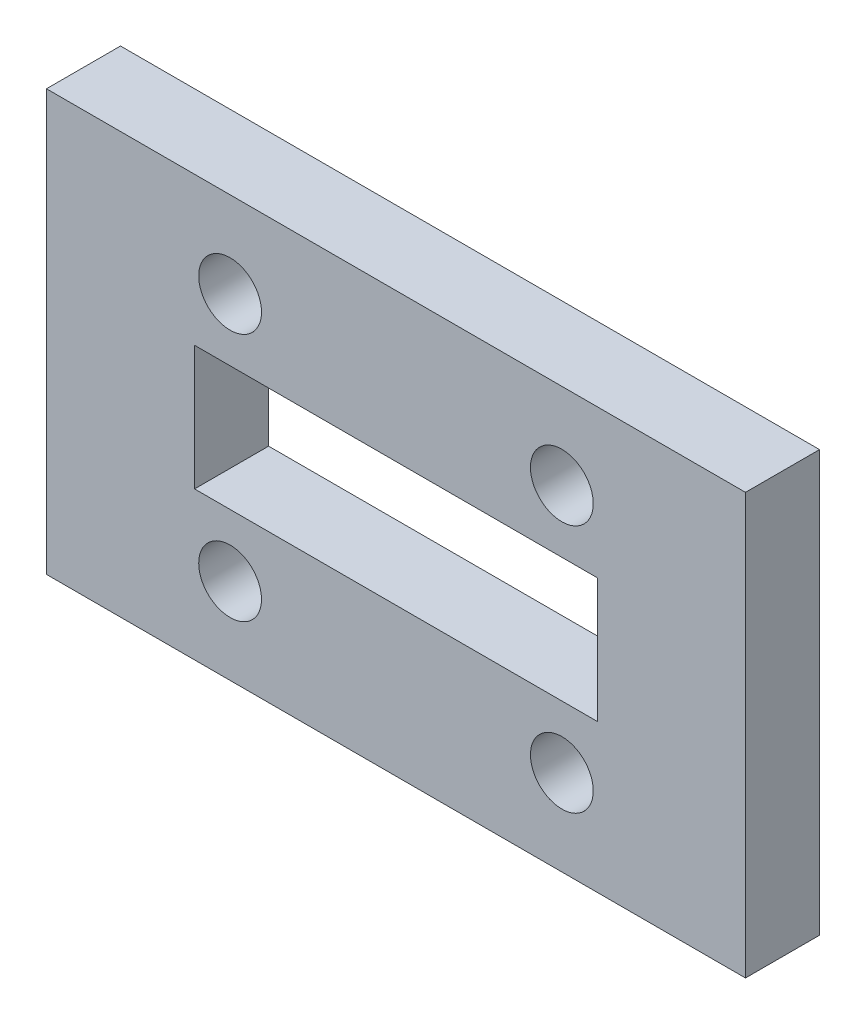
ISO-10303-21;
HEADER;
FILE_DESCRIPTION(('STEP AP214'),'2;1');
FILE_NAME('part.step','',(''),(''),'','','');
FILE_SCHEMA(('AUTOMOTIVE_DESIGN { 1 0 10303 214 1 1 1 1 }'));
ENDSEC;
DATA;
#1=APPLICATION_CONTEXT('core data for automotive mechanical design processes');
#2=APPLICATION_PROTOCOL_DEFINITION('international standard','automotive_design',2000,#1);
#3=PRODUCT_CONTEXT('',#1,'mechanical');
#4=PRODUCT('Part','Part','',(#3));
#5=PRODUCT_RELATED_PRODUCT_CATEGORY('part','',(#4));
#6=PRODUCT_DEFINITION_FORMATION('','',#4);
#7=PRODUCT_DEFINITION_CONTEXT('part definition',#1,'design');
#8=PRODUCT_DEFINITION('design','',#6,#7);
#9=PRODUCT_DEFINITION_SHAPE('','',#8);
#10=(LENGTH_UNIT() NAMED_UNIT(*) SI_UNIT(.MILLI.,.METRE.));
#11=(NAMED_UNIT(*) PLANE_ANGLE_UNIT() SI_UNIT($,.RADIAN.));
#12=(NAMED_UNIT(*) SI_UNIT($,.STERADIAN.) SOLID_ANGLE_UNIT());
#13=UNCERTAINTY_MEASURE_WITH_UNIT(LENGTH_MEASURE(1.E-05),#10,'distance_accuracy_value','');
#14=(GEOMETRIC_REPRESENTATION_CONTEXT(3) GLOBAL_UNCERTAINTY_ASSIGNED_CONTEXT((#13)) GLOBAL_UNIT_ASSIGNED_CONTEXT((#10,
#11,#12)) REPRESENTATION_CONTEXT('',''));
#15=CARTESIAN_POINT('',(0.,0.,0.));
#16=DIRECTION('',(0.,0.,1.));
#17=DIRECTION('',(1.,0.,0.));
#18=AXIS2_PLACEMENT_3D('',#15,#16,#17);
#19=CARTESIAN_POINT('',(0.,0.,3.175));
#20=DIRECTION('',(0.,0.,1.));
#21=DIRECTION('',(1.,0.,0.));
#22=AXIS2_PLACEMENT_3D('',#19,#20,#21);
#23=PLANE('',#22);
#24=CARTESIAN_POINT('',(7.112,-5.334,3.175));
#25=DIRECTION('',(0.,0.,1.));
#26=DIRECTION('',(1.,0.,0.));
#27=AXIS2_PLACEMENT_3D('',#24,#25,#26);
#28=CIRCLE('',#27,1.3462);
#29=CARTESIAN_POINT('',(8.4582,-5.334,3.175));
#30=VERTEX_POINT('',#29);
#31=EDGE_CURVE('E245',#30,#30,#28,.T.);
#32=ORIENTED_EDGE('',*,*,#31,.F.);
#33=EDGE_LOOP('',(#32));
#34=FACE_BOUND('',#33,.T.);
#35=CARTESIAN_POINT('',(-7.112,5.334,3.175));
#36=DIRECTION('',(0.,0.,1.));
#37=DIRECTION('',(1.,0.,0.));
#38=AXIS2_PLACEMENT_3D('',#35,#36,#37);
#39=CIRCLE('',#38,1.3462);
#40=CARTESIAN_POINT('',(-5.7658,5.334,3.175));
#41=VERTEX_POINT('',#40);
#42=EDGE_CURVE('E127',#41,#41,#39,.T.);
#43=ORIENTED_EDGE('',*,*,#42,.F.);
#44=EDGE_LOOP('',(#43));
#45=FACE_BOUND('',#44,.T.);
#46=DIRECTION('',(0.,-1.,0.));
#47=VECTOR('',#46,1.);
#48=CARTESIAN_POINT('',(-14.986,-9.017,3.175));
#49=LINE('',#48,#47);
#50=CARTESIAN_POINT('',(-14.986,9.017,3.175));
#51=VERTEX_POINT('',#50);
#52=CARTESIAN_POINT('',(-14.986,-9.017,3.175));
#53=VERTEX_POINT('',#52);
#54=EDGE_CURVE('E137',#51,#53,#49,.T.);
#55=ORIENTED_EDGE('',*,*,#54,.T.);
#56=DIRECTION('',(1.,0.,0.));
#57=VECTOR('',#56,1.);
#58=CARTESIAN_POINT('',(14.986,-9.017,3.175));
#59=LINE('',#58,#57);
#60=CARTESIAN_POINT('',(14.986,-9.017,3.175));
#61=VERTEX_POINT('',#60);
#62=EDGE_CURVE('E140',#53,#61,#59,.T.);
#63=ORIENTED_EDGE('',*,*,#62,.T.);
#64=DIRECTION('',(0.,1.,0.));
#65=VECTOR('',#64,1.);
#66=CARTESIAN_POINT('',(14.986,-9.017,3.175));
#67=LINE('',#66,#65);
#68=CARTESIAN_POINT('',(14.986,9.017,3.175));
#69=VERTEX_POINT('',#68);
#70=EDGE_CURVE('E143',#61,#69,#67,.T.);
#71=ORIENTED_EDGE('',*,*,#70,.T.);
#72=DIRECTION('',(-1.,0.,0.));
#73=VECTOR('',#72,1.);
#74=CARTESIAN_POINT('',(14.986,9.017,3.175));
#75=LINE('',#74,#73);
#76=EDGE_CURVE('E145',#69,#51,#75,.T.);
#77=ORIENTED_EDGE('',*,*,#76,.T.);
#78=EDGE_LOOP('',(#55,#63,#71,#77));
#79=FACE_BOUND('',#78,.T.);
#80=DIRECTION('',(1.,0.,0.));
#81=VECTOR('',#80,1.);
#82=CARTESIAN_POINT('',(8.636,-2.667,3.175));
#83=LINE('',#82,#81);
#84=CARTESIAN_POINT('',(-8.636,-2.667,3.175));
#85=VERTEX_POINT('',#84);
#86=CARTESIAN_POINT('',(8.636,-2.667,3.175));
#87=VERTEX_POINT('',#86);
#88=EDGE_CURVE('E106',#85,#87,#83,.T.);
#89=ORIENTED_EDGE('',*,*,#88,.F.);
#90=DIRECTION('',(0.,-1.,0.));
#91=VECTOR('',#90,1.);
#92=CARTESIAN_POINT('',(-8.636,-2.667,3.175));
#93=LINE('',#92,#91);
#94=CARTESIAN_POINT('',(-8.636,2.667,3.175));
#95=VERTEX_POINT('',#94);
#96=EDGE_CURVE('E98',#95,#85,#93,.T.);
#97=ORIENTED_EDGE('',*,*,#96,.F.);
#98=DIRECTION('',(-1.,0.,0.));
#99=VECTOR('',#98,1.);
#100=CARTESIAN_POINT('',(8.636,2.667,3.175));
#101=LINE('',#100,#99);
#102=CARTESIAN_POINT('',(8.636,2.667,3.175));
#103=VERTEX_POINT('',#102);
#104=EDGE_CURVE('E121',#103,#95,#101,.T.);
#105=ORIENTED_EDGE('',*,*,#104,.F.);
#106=DIRECTION('',(0.,1.,0.));
#107=VECTOR('',#106,1.);
#108=CARTESIAN_POINT('',(8.636,-2.667,3.175));
#109=LINE('',#108,#107);
#110=EDGE_CURVE('E119',#87,#103,#109,.T.);
#111=ORIENTED_EDGE('',*,*,#110,.F.);
#112=EDGE_LOOP('',(#89,#97,#105,#111));
#113=FACE_BOUND('',#112,.T.);
#114=CARTESIAN_POINT('',(7.112,5.334,3.175));
#115=DIRECTION('',(0.,0.,1.));
#116=DIRECTION('',(-1.,0.,0.));
#117=AXIS2_PLACEMENT_3D('',#114,#115,#116);
#118=CIRCLE('',#117,1.3462);
#119=CARTESIAN_POINT('',(5.7658,5.334,3.175));
#120=VERTEX_POINT('',#119);
#121=EDGE_CURVE('E251',#120,#120,#118,.T.);
#122=ORIENTED_EDGE('',*,*,#121,.F.);
#123=EDGE_LOOP('',(#122));
#124=FACE_BOUND('',#123,.T.);
#125=CARTESIAN_POINT('',(-7.112,-5.334,3.175));
#126=DIRECTION('',(0.,0.,1.));
#127=DIRECTION('',(-1.,0.,0.));
#128=AXIS2_PLACEMENT_3D('',#125,#126,#127);
#129=CIRCLE('',#128,1.3462);
#130=CARTESIAN_POINT('',(-8.4582,-5.334,3.175));
#131=VERTEX_POINT('',#130);
#132=EDGE_CURVE('E236',#131,#131,#129,.T.);
#133=ORIENTED_EDGE('',*,*,#132,.F.);
#134=EDGE_LOOP('',(#133));
#135=FACE_BOUND('',#134,.T.);
#136=ADVANCED_FACE('F33',(#34,#45,#79,#113,#124,#135),#23,.T.);
#137=CARTESIAN_POINT('',(0.,0.,0.));
#138=DIRECTION('',(0.,0.,1.));
#139=DIRECTION('',(1.,0.,0.));
#140=AXIS2_PLACEMENT_3D('',#137,#138,#139);
#141=PLANE('',#140);
#142=DIRECTION('',(0.,-1.,0.));
#143=VECTOR('',#142,1.);
#144=CARTESIAN_POINT('',(-14.986,-9.017,0.));
#145=LINE('',#144,#143);
#146=CARTESIAN_POINT('',(-14.986,9.017,0.));
#147=VERTEX_POINT('',#146);
#148=CARTESIAN_POINT('',(-14.986,-9.017,0.));
#149=VERTEX_POINT('',#148);
#150=EDGE_CURVE('E114',#147,#149,#145,.T.);
#151=ORIENTED_EDGE('',*,*,#150,.F.);
#152=DIRECTION('',(-1.,0.,0.));
#153=VECTOR('',#152,1.);
#154=CARTESIAN_POINT('',(14.986,9.017,0.));
#155=LINE('',#154,#153);
#156=CARTESIAN_POINT('',(14.986,9.017,0.));
#157=VERTEX_POINT('',#156);
#158=EDGE_CURVE('E141',#157,#147,#155,.T.);
#159=ORIENTED_EDGE('',*,*,#158,.F.);
#160=DIRECTION('',(0.,1.,0.));
#161=VECTOR('',#160,1.);
#162=CARTESIAN_POINT('',(14.986,-9.017,0.));
#163=LINE('',#162,#161);
#164=CARTESIAN_POINT('',(14.986,-9.017,0.));
#165=VERTEX_POINT('',#164);
#166=EDGE_CURVE('E152',#165,#157,#163,.T.);
#167=ORIENTED_EDGE('',*,*,#166,.F.);
#168=DIRECTION('',(1.,0.,0.));
#169=VECTOR('',#168,1.);
#170=CARTESIAN_POINT('',(14.986,-9.017,0.));
#171=LINE('',#170,#169);
#172=EDGE_CURVE('E150',#149,#165,#171,.T.);
#173=ORIENTED_EDGE('',*,*,#172,.F.);
#174=EDGE_LOOP('',(#151,#159,#167,#173));
#175=FACE_BOUND('',#174,.T.);
#176=DIRECTION('',(0.,-1.,0.));
#177=VECTOR('',#176,1.);
#178=CARTESIAN_POINT('',(-8.636,-2.667,0.));
#179=LINE('',#178,#177);
#180=CARTESIAN_POINT('',(-8.636,2.667,0.));
#181=VERTEX_POINT('',#180);
#182=CARTESIAN_POINT('',(-8.636,-2.667,0.));
#183=VERTEX_POINT('',#182);
#184=EDGE_CURVE('E56',#181,#183,#179,.T.);
#185=ORIENTED_EDGE('',*,*,#184,.T.);
#186=DIRECTION('',(1.,0.,0.));
#187=VECTOR('',#186,1.);
#188=CARTESIAN_POINT('',(8.636,-2.667,0.));
#189=LINE('',#188,#187);
#190=CARTESIAN_POINT('',(8.636,-2.667,0.));
#191=VERTEX_POINT('',#190);
#192=EDGE_CURVE('E113',#183,#191,#189,.T.);
#193=ORIENTED_EDGE('',*,*,#192,.T.);
#194=DIRECTION('',(0.,1.,0.));
#195=VECTOR('',#194,1.);
#196=CARTESIAN_POINT('',(8.636,-2.667,0.));
#197=LINE('',#196,#195);
#198=CARTESIAN_POINT('',(8.636,2.667,0.));
#199=VERTEX_POINT('',#198);
#200=EDGE_CURVE('E129',#191,#199,#197,.T.);
#201=ORIENTED_EDGE('',*,*,#200,.T.);
#202=DIRECTION('',(-1.,0.,0.));
#203=VECTOR('',#202,1.);
#204=CARTESIAN_POINT('',(8.636,2.667,0.));
#205=LINE('',#204,#203);
#206=EDGE_CURVE('E107',#199,#181,#205,.T.);
#207=ORIENTED_EDGE('',*,*,#206,.T.);
#208=EDGE_LOOP('',(#185,#193,#201,#207));
#209=FACE_BOUND('',#208,.T.);
#210=CARTESIAN_POINT('',(-7.112,5.334,0.));
#211=DIRECTION('',(0.,0.,1.));
#212=DIRECTION('',(1.,0.,0.));
#213=AXIS2_PLACEMENT_3D('',#210,#211,#212);
#214=CIRCLE('',#213,1.3462);
#215=CARTESIAN_POINT('',(-5.7658,5.334,0.));
#216=VERTEX_POINT('',#215);
#217=EDGE_CURVE('E254',#216,#216,#214,.T.);
#218=ORIENTED_EDGE('',*,*,#217,.T.);
#219=EDGE_LOOP('',(#218));
#220=FACE_BOUND('',#219,.T.);
#221=CARTESIAN_POINT('',(7.112,5.334,0.));
#222=DIRECTION('',(0.,0.,1.));
#223=DIRECTION('',(-1.,0.,0.));
#224=AXIS2_PLACEMENT_3D('',#221,#222,#223);
#225=CIRCLE('',#224,1.3462);
#226=CARTESIAN_POINT('',(5.7658,5.334,0.));
#227=VERTEX_POINT('',#226);
#228=EDGE_CURVE('E248',#227,#227,#225,.T.);
#229=ORIENTED_EDGE('',*,*,#228,.T.);
#230=EDGE_LOOP('',(#229));
#231=FACE_BOUND('',#230,.T.);
#232=CARTESIAN_POINT('',(7.112,-5.334,0.));
#233=DIRECTION('',(0.,0.,1.));
#234=DIRECTION('',(1.,0.,0.));
#235=AXIS2_PLACEMENT_3D('',#232,#233,#234);
#236=CIRCLE('',#235,1.3462);
#237=CARTESIAN_POINT('',(8.4582,-5.334,0.));
#238=VERTEX_POINT('',#237);
#239=EDGE_CURVE('E242',#238,#238,#236,.T.);
#240=ORIENTED_EDGE('',*,*,#239,.T.);
#241=EDGE_LOOP('',(#240));
#242=FACE_BOUND('',#241,.T.);
#243=CARTESIAN_POINT('',(-7.112,-5.334,0.));
#244=DIRECTION('',(0.,0.,1.));
#245=DIRECTION('',(-1.,0.,0.));
#246=AXIS2_PLACEMENT_3D('',#243,#244,#245);
#247=CIRCLE('',#246,1.3462);
#248=CARTESIAN_POINT('',(-8.4582,-5.334,0.));
#249=VERTEX_POINT('',#248);
#250=EDGE_CURVE('E239',#249,#249,#247,.T.);
#251=ORIENTED_EDGE('',*,*,#250,.T.);
#252=EDGE_LOOP('',(#251));
#253=FACE_BOUND('',#252,.T.);
#254=ADVANCED_FACE('F170',(#175,#209,#220,#231,#242,#253),#141,.F.);
#255=CARTESIAN_POINT('',(-14.986,-9.017,3.175));
#256=DIRECTION('',(1.,0.,0.));
#257=DIRECTION('',(0.,0.,-1.));
#258=AXIS2_PLACEMENT_3D('',#255,#256,#257);
#259=PLANE('',#258);
#260=ORIENTED_EDGE('',*,*,#150,.T.);
#261=DIRECTION('',(0.,0.,-1.));
#262=VECTOR('',#261,1.);
#263=CARTESIAN_POINT('',(-14.986,-9.017,3.175));
#264=LINE('',#263,#262);
#265=EDGE_CURVE('E11',#53,#149,#264,.T.);
#266=ORIENTED_EDGE('',*,*,#265,.F.);
#267=ORIENTED_EDGE('',*,*,#54,.F.);
#268=DIRECTION('',(0.,0.,-1.));
#269=VECTOR('',#268,1.);
#270=CARTESIAN_POINT('',(-14.986,9.017,3.175));
#271=LINE('',#270,#269);
#272=EDGE_CURVE('E147',#51,#147,#271,.T.);
#273=ORIENTED_EDGE('',*,*,#272,.T.);
#274=EDGE_LOOP('',(#260,#266,#267,#273));
#275=FACE_BOUND('',#274,.T.);
#276=ADVANCED_FACE('F35',(#275),#259,.F.);
#277=CARTESIAN_POINT('',(14.986,-9.017,3.175));
#278=DIRECTION('',(0.,1.,0.));
#279=DIRECTION('',(-1.,0.,0.));
#280=AXIS2_PLACEMENT_3D('',#277,#278,#279);
#281=PLANE('',#280);
#282=ORIENTED_EDGE('',*,*,#172,.T.);
#283=DIRECTION('',(0.,0.,-1.));
#284=VECTOR('',#283,1.);
#285=CARTESIAN_POINT('',(14.986,-9.017,3.175));
#286=LINE('',#285,#284);
#287=EDGE_CURVE('E41',#61,#165,#286,.T.);
#288=ORIENTED_EDGE('',*,*,#287,.F.);
#289=ORIENTED_EDGE('',*,*,#62,.F.);
#290=ORIENTED_EDGE('',*,*,#265,.T.);
#291=EDGE_LOOP('',(#282,#288,#289,#290));
#292=FACE_BOUND('',#291,.T.);
#293=ADVANCED_FACE('F180',(#292),#281,.F.);
#294=CARTESIAN_POINT('',(14.986,-9.017,3.175));
#295=DIRECTION('',(-1.,0.,0.));
#296=DIRECTION('',(0.,0.,1.));
#297=AXIS2_PLACEMENT_3D('',#294,#295,#296);
#298=PLANE('',#297);
#299=ORIENTED_EDGE('',*,*,#166,.T.);
#300=DIRECTION('',(0.,0.,-1.));
#301=VECTOR('',#300,1.);
#302=CARTESIAN_POINT('',(14.986,9.017,3.175));
#303=LINE('',#302,#301);
#304=EDGE_CURVE('E157',#69,#157,#303,.T.);
#305=ORIENTED_EDGE('',*,*,#304,.F.);
#306=ORIENTED_EDGE('',*,*,#70,.F.);
#307=ORIENTED_EDGE('',*,*,#287,.T.);
#308=EDGE_LOOP('',(#299,#305,#306,#307));
#309=FACE_BOUND('',#308,.T.);
#310=ADVANCED_FACE('F164',(#309),#298,.F.);
#311=CARTESIAN_POINT('',(14.986,9.017,3.175));
#312=DIRECTION('',(0.,-1.,0.));
#313=DIRECTION('',(1.,0.,0.));
#314=AXIS2_PLACEMENT_3D('',#311,#312,#313);
#315=PLANE('',#314);
#316=ORIENTED_EDGE('',*,*,#158,.T.);
#317=ORIENTED_EDGE('',*,*,#272,.F.);
#318=ORIENTED_EDGE('',*,*,#76,.F.);
#319=ORIENTED_EDGE('',*,*,#304,.T.);
#320=EDGE_LOOP('',(#316,#317,#318,#319));
#321=FACE_BOUND('',#320,.T.);
#322=ADVANCED_FACE('F174',(#321),#315,.F.);
#323=CARTESIAN_POINT('',(-8.636,-2.667,3.175));
#324=DIRECTION('',(1.,0.,0.));
#325=DIRECTION('',(0.,0.,-1.));
#326=AXIS2_PLACEMENT_3D('',#323,#324,#325);
#327=PLANE('',#326);
#328=ORIENTED_EDGE('',*,*,#184,.F.);
#329=DIRECTION('',(0.,0.,-1.));
#330=VECTOR('',#329,1.);
#331=CARTESIAN_POINT('',(-8.636,2.667,3.175));
#332=LINE('',#331,#330);
#333=EDGE_CURVE('E102',#95,#181,#332,.T.);
#334=ORIENTED_EDGE('',*,*,#333,.F.);
#335=ORIENTED_EDGE('',*,*,#96,.T.);
#336=DIRECTION('',(0.,0.,-1.));
#337=VECTOR('',#336,1.);
#338=CARTESIAN_POINT('',(-8.636,-2.667,3.175));
#339=LINE('',#338,#337);
#340=EDGE_CURVE('E101',#85,#183,#339,.T.);
#341=ORIENTED_EDGE('',*,*,#340,.T.);
#342=EDGE_LOOP('',(#328,#334,#335,#341));
#343=FACE_BOUND('',#342,.T.);
#344=ADVANCED_FACE('F100',(#343),#327,.T.);
#345=CARTESIAN_POINT('',(8.636,-2.667,3.175));
#346=DIRECTION('',(0.,1.,0.));
#347=DIRECTION('',(-1.,0.,0.));
#348=AXIS2_PLACEMENT_3D('',#345,#346,#347);
#349=PLANE('',#348);
#350=ORIENTED_EDGE('',*,*,#192,.F.);
#351=ORIENTED_EDGE('',*,*,#340,.F.);
#352=ORIENTED_EDGE('',*,*,#88,.T.);
#353=DIRECTION('',(0.,0.,-1.));
#354=VECTOR('',#353,1.);
#355=CARTESIAN_POINT('',(8.636,-2.667,3.175));
#356=LINE('',#355,#354);
#357=EDGE_CURVE('E115',#87,#191,#356,.T.);
#358=ORIENTED_EDGE('',*,*,#357,.T.);
#359=EDGE_LOOP('',(#350,#351,#352,#358));
#360=FACE_BOUND('',#359,.T.);
#361=ADVANCED_FACE('F110',(#360),#349,.T.);
#362=CARTESIAN_POINT('',(8.636,-2.667,3.175));
#363=DIRECTION('',(-1.,0.,0.));
#364=DIRECTION('',(0.,0.,1.));
#365=AXIS2_PLACEMENT_3D('',#362,#363,#364);
#366=PLANE('',#365);
#367=ORIENTED_EDGE('',*,*,#200,.F.);
#368=ORIENTED_EDGE('',*,*,#357,.F.);
#369=ORIENTED_EDGE('',*,*,#110,.T.);
#370=DIRECTION('',(0.,0.,-1.));
#371=VECTOR('',#370,1.);
#372=CARTESIAN_POINT('',(8.636,2.667,3.175));
#373=LINE('',#372,#371);
#374=EDGE_CURVE('E48',#103,#199,#373,.T.);
#375=ORIENTED_EDGE('',*,*,#374,.T.);
#376=EDGE_LOOP('',(#367,#368,#369,#375));
#377=FACE_BOUND('',#376,.T.);
#378=ADVANCED_FACE('F206',(#377),#366,.T.);
#379=CARTESIAN_POINT('',(8.636,2.667,3.175));
#380=DIRECTION('',(0.,-1.,0.));
#381=DIRECTION('',(0.,0.,-1.));
#382=AXIS2_PLACEMENT_3D('',#379,#380,#381);
#383=PLANE('',#382);
#384=ORIENTED_EDGE('',*,*,#206,.F.);
#385=ORIENTED_EDGE('',*,*,#374,.F.);
#386=ORIENTED_EDGE('',*,*,#104,.T.);
#387=ORIENTED_EDGE('',*,*,#333,.T.);
#388=EDGE_LOOP('',(#384,#385,#386,#387));
#389=FACE_BOUND('',#388,.T.);
#390=ADVANCED_FACE('F210',(#389),#383,.T.);
#391=CARTESIAN_POINT('',(-7.112,5.334,3.175));
#392=DIRECTION('',(0.,0.,-1.));
#393=DIRECTION('',(-1.,0.,0.));
#394=AXIS2_PLACEMENT_3D('',#391,#392,#393);
#395=CYLINDRICAL_SURFACE('',#394,1.3462);
#396=ORIENTED_EDGE('',*,*,#42,.T.);
#397=EDGE_LOOP('',(#396));
#398=FACE_BOUND('',#397,.T.);
#399=ORIENTED_EDGE('',*,*,#217,.F.);
#400=EDGE_LOOP('',(#399));
#401=FACE_BOUND('',#400,.T.);
#402=ADVANCED_FACE('F216',(#398,#401),#395,.F.);
#403=CARTESIAN_POINT('',(7.112,5.334,3.175));
#404=DIRECTION('',(0.,0.,-1.));
#405=DIRECTION('',(-1.,0.,0.));
#406=AXIS2_PLACEMENT_3D('',#403,#404,#405);
#407=CYLINDRICAL_SURFACE('',#406,1.3462);
#408=ORIENTED_EDGE('',*,*,#121,.T.);
#409=EDGE_LOOP('',(#408));
#410=FACE_BOUND('',#409,.T.);
#411=ORIENTED_EDGE('',*,*,#228,.F.);
#412=EDGE_LOOP('',(#411));
#413=FACE_BOUND('',#412,.T.);
#414=ADVANCED_FACE('F219',(#410,#413),#407,.F.);
#415=CARTESIAN_POINT('',(7.112,-5.334,3.175));
#416=DIRECTION('',(0.,0.,-1.));
#417=DIRECTION('',(-1.,0.,0.));
#418=AXIS2_PLACEMENT_3D('',#415,#416,#417);
#419=CYLINDRICAL_SURFACE('',#418,1.3462);
#420=ORIENTED_EDGE('',*,*,#31,.T.);
#421=EDGE_LOOP('',(#420));
#422=FACE_BOUND('',#421,.T.);
#423=ORIENTED_EDGE('',*,*,#239,.F.);
#424=EDGE_LOOP('',(#423));
#425=FACE_BOUND('',#424,.T.);
#426=ADVANCED_FACE('F223',(#422,#425),#419,.F.);
#427=CARTESIAN_POINT('',(-7.112,-5.334,3.175));
#428=DIRECTION('',(0.,0.,-1.));
#429=DIRECTION('',(-1.,0.,0.));
#430=AXIS2_PLACEMENT_3D('',#427,#428,#429);
#431=CYLINDRICAL_SURFACE('',#430,1.3462);
#432=ORIENTED_EDGE('',*,*,#132,.T.);
#433=EDGE_LOOP('',(#432));
#434=FACE_BOUND('',#433,.T.);
#435=ORIENTED_EDGE('',*,*,#250,.F.);
#436=EDGE_LOOP('',(#435));
#437=FACE_BOUND('',#436,.T.);
#438=ADVANCED_FACE('F227',(#434,#437),#431,.F.);
#439=CLOSED_SHELL('',(#136,#254,#276,#293,#310,#322,#344,#361,#378,#390,#402,#414,#426,#438));
#440=MANIFOLD_SOLID_BREP('B2',#439);
#441=ADVANCED_BREP_SHAPE_REPRESENTATION('',(#18,#440),#14);
#442=SHAPE_DEFINITION_REPRESENTATION(#9,#441);
ENDSEC;
END-ISO-10303-21;
